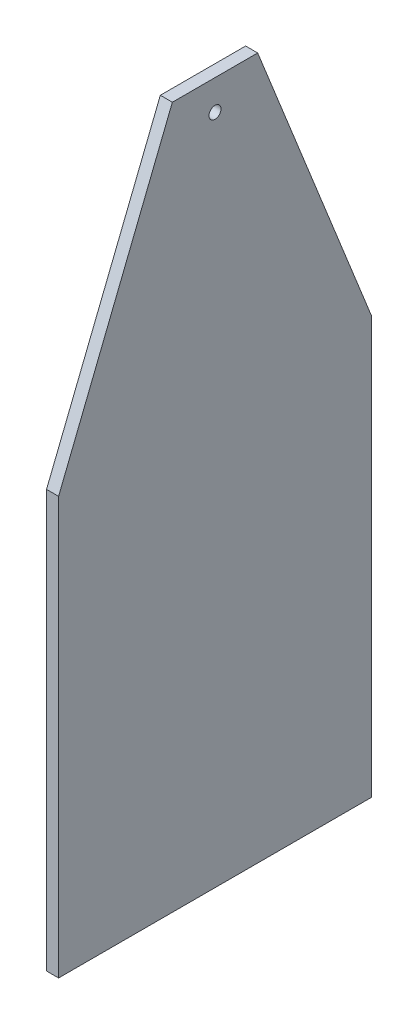
ISO-10303-21;
HEADER;
FILE_DESCRIPTION(('STEP AP214'),'2;1');
FILE_NAME('part.step','',(''),(''),'','','');
FILE_SCHEMA(('AUTOMOTIVE_DESIGN { 1 0 10303 214 1 1 1 1 }'));
ENDSEC;
DATA;
#1=APPLICATION_CONTEXT('core data for automotive mechanical design processes');
#2=APPLICATION_PROTOCOL_DEFINITION('international standard','automotive_design',2000,#1);
#3=PRODUCT_CONTEXT('',#1,'mechanical');
#4=PRODUCT('Part','Part','',(#3));
#5=PRODUCT_RELATED_PRODUCT_CATEGORY('part','',(#4));
#6=PRODUCT_DEFINITION_FORMATION('','',#4);
#7=PRODUCT_DEFINITION_CONTEXT('part definition',#1,'design');
#8=PRODUCT_DEFINITION('design','',#6,#7);
#9=PRODUCT_DEFINITION_SHAPE('','',#8);
#10=(LENGTH_UNIT() NAMED_UNIT(*) SI_UNIT(.MILLI.,.METRE.));
#11=(NAMED_UNIT(*) PLANE_ANGLE_UNIT() SI_UNIT($,.RADIAN.));
#12=(NAMED_UNIT(*) SI_UNIT($,.STERADIAN.) SOLID_ANGLE_UNIT());
#13=UNCERTAINTY_MEASURE_WITH_UNIT(LENGTH_MEASURE(1.E-05),#10,'distance_accuracy_value','');
#14=(GEOMETRIC_REPRESENTATION_CONTEXT(3) GLOBAL_UNCERTAINTY_ASSIGNED_CONTEXT((#13)) GLOBAL_UNIT_ASSIGNED_CONTEXT((#10,
#11,#12)) REPRESENTATION_CONTEXT('',''));
#15=CARTESIAN_POINT('',(0.,0.,0.));
#16=DIRECTION('',(0.,0.,1.));
#17=DIRECTION('',(1.,0.,0.));
#18=AXIS2_PLACEMENT_3D('',#15,#16,#17);
#19=CARTESIAN_POINT('',(0.,370.,-82.5));
#20=DIRECTION('',(1.,0.,0.));
#21=DIRECTION('',(0.,0.,-1.));
#22=AXIS2_PLACEMENT_3D('',#19,#20,#21);
#23=PLANE('',#22);
#24=CARTESIAN_POINT('',(0.,354.147260033209,0.));
#25=DIRECTION('',(1.,0.,0.));
#26=DIRECTION('',(0.,0.,-1.));
#27=AXIS2_PLACEMENT_3D('',#24,#25,#26);
#28=CIRCLE('',#27,3.17499999999998);
#29=CARTESIAN_POINT('',(0.,354.147260033209,-3.17499999999998));
#30=VERTEX_POINT('',#29);
#31=EDGE_CURVE('E131',#30,#30,#28,.T.);
#32=ORIENTED_EDGE('',*,*,#31,.T.);
#33=EDGE_LOOP('',(#32));
#34=FACE_BOUND('',#33,.T.);
#35=DIRECTION('',(0.,0.,1.));
#36=VECTOR('',#35,1.);
#37=CARTESIAN_POINT('',(0.,370.,-82.5));
#38=LINE('',#37,#36);
#39=CARTESIAN_POINT('',(0.,370.,-22.5));
#40=VERTEX_POINT('',#39);
#41=CARTESIAN_POINT('',(0.,370.,22.5));
#42=VERTEX_POINT('',#41);
#43=EDGE_CURVE('E98',#40,#42,#38,.T.);
#44=ORIENTED_EDGE('',*,*,#43,.F.);
#45=DIRECTION('',(0.,-0.928476690885259,-0.371390676354104));
#46=VECTOR('',#45,1.);
#47=CARTESIAN_POINT('',(0.,370.,-22.5));
#48=LINE('',#47,#46);
#49=CARTESIAN_POINT('',(0.,220.,-82.5));
#50=VERTEX_POINT('',#49);
#51=EDGE_CURVE('E47',#40,#50,#48,.T.);
#52=ORIENTED_EDGE('',*,*,#51,.T.);
#53=DIRECTION('',(0.,-1.,0.));
#54=VECTOR('',#53,1.);
#55=CARTESIAN_POINT('',(0.,370.,-82.5));
#56=LINE('',#55,#54);
#57=CARTESIAN_POINT('',(0.,0.,-82.5));
#58=VERTEX_POINT('',#57);
#59=EDGE_CURVE('E95',#50,#58,#56,.T.);
#60=ORIENTED_EDGE('',*,*,#59,.T.);
#61=DIRECTION('',(0.,0.,1.));
#62=VECTOR('',#61,1.);
#63=CARTESIAN_POINT('',(0.,0.,-82.5));
#64=LINE('',#63,#62);
#65=CARTESIAN_POINT('',(0.,0.,82.5));
#66=VERTEX_POINT('',#65);
#67=EDGE_CURVE('E127',#58,#66,#64,.T.);
#68=ORIENTED_EDGE('',*,*,#67,.T.);
#69=DIRECTION('',(0.,-1.,0.));
#70=VECTOR('',#69,1.);
#71=CARTESIAN_POINT('',(0.,370.,82.5));
#72=LINE('',#71,#70);
#73=CARTESIAN_POINT('',(0.,220.,82.5));
#74=VERTEX_POINT('',#73);
#75=EDGE_CURVE('E11',#74,#66,#72,.T.);
#76=ORIENTED_EDGE('',*,*,#75,.F.);
#77=DIRECTION('',(0.,0.928476690885259,-0.371390676354104));
#78=VECTOR('',#77,1.);
#79=CARTESIAN_POINT('',(0.,370.,22.5));
#80=LINE('',#79,#78);
#81=EDGE_CURVE('E142',#74,#42,#80,.T.);
#82=ORIENTED_EDGE('',*,*,#81,.T.);
#83=EDGE_LOOP('',(#44,#52,#60,#68,#76,#82));
#84=FACE_BOUND('',#83,.T.);
#85=ADVANCED_FACE('F33',(#34,#84),#23,.F.);
#86=CARTESIAN_POINT('',(0.,370.,82.5));
#87=DIRECTION('',(0.,0.,-1.));
#88=DIRECTION('',(-1.,0.,0.));
#89=AXIS2_PLACEMENT_3D('',#86,#87,#88);
#90=PLANE('',#89);
#91=DIRECTION('',(0.,-1.,0.));
#92=VECTOR('',#91,1.);
#93=CARTESIAN_POINT('',(6.35000000000001,370.,82.5));
#94=LINE('',#93,#92);
#95=CARTESIAN_POINT('',(6.35000000000001,220.,82.5));
#96=VERTEX_POINT('',#95);
#97=CARTESIAN_POINT('',(6.35000000000001,0.,82.5));
#98=VERTEX_POINT('',#97);
#99=EDGE_CURVE('E40',#96,#98,#94,.T.);
#100=ORIENTED_EDGE('',*,*,#99,.F.);
#101=DIRECTION('',(1.,0.,0.));
#102=VECTOR('',#101,1.);
#103=CARTESIAN_POINT('',(0.,220.,82.5));
#104=LINE('',#103,#102);
#105=EDGE_CURVE('E140',#74,#96,#104,.T.);
#106=ORIENTED_EDGE('',*,*,#105,.F.);
#107=ORIENTED_EDGE('',*,*,#75,.T.);
#108=DIRECTION('',(1.,0.,0.));
#109=VECTOR('',#108,1.);
#110=CARTESIAN_POINT('',(0.,0.,82.5));
#111=LINE('',#110,#109);
#112=EDGE_CURVE('E123',#66,#98,#111,.T.);
#113=ORIENTED_EDGE('',*,*,#112,.T.);
#114=EDGE_LOOP('',(#100,#106,#107,#113));
#115=FACE_BOUND('',#114,.T.);
#116=ADVANCED_FACE('F124',(#115),#90,.F.);
#117=CARTESIAN_POINT('',(6.35,370.,-82.5));
#118=DIRECTION('',(-1.,0.,0.));
#119=DIRECTION('',(0.,0.,1.));
#120=AXIS2_PLACEMENT_3D('',#117,#118,#119);
#121=PLANE('',#120);
#122=CARTESIAN_POINT('',(6.35000000000001,354.147260033209,0.));
#123=DIRECTION('',(1.,0.,0.));
#124=DIRECTION('',(0.,0.,-1.));
#125=AXIS2_PLACEMENT_3D('',#122,#123,#124);
#126=CIRCLE('',#125,3.17499999999998);
#127=CARTESIAN_POINT('',(6.35000000000001,354.147260033209,-3.17499999999998));
#128=VERTEX_POINT('',#127);
#129=EDGE_CURVE('E136',#128,#128,#126,.T.);
#130=ORIENTED_EDGE('',*,*,#129,.F.);
#131=EDGE_LOOP('',(#130));
#132=FACE_BOUND('',#131,.T.);
#133=DIRECTION('',(0.,-1.,0.));
#134=VECTOR('',#133,1.);
#135=CARTESIAN_POINT('',(6.35,370.,-82.5));
#136=LINE('',#135,#134);
#137=CARTESIAN_POINT('',(6.35,220.,-82.5));
#138=VERTEX_POINT('',#137);
#139=CARTESIAN_POINT('',(6.35,0.,-82.5));
#140=VERTEX_POINT('',#139);
#141=EDGE_CURVE('E104',#138,#140,#136,.T.);
#142=ORIENTED_EDGE('',*,*,#141,.F.);
#143=DIRECTION('',(0.,-0.928476690885259,-0.371390676354104));
#144=VECTOR('',#143,1.);
#145=CARTESIAN_POINT('',(6.35000000000001,370.,-22.5));
#146=LINE('',#145,#144);
#147=CARTESIAN_POINT('',(6.35000000000001,370.,-22.5));
#148=VERTEX_POINT('',#147);
#149=EDGE_CURVE('E86',#148,#138,#146,.T.);
#150=ORIENTED_EDGE('',*,*,#149,.F.);
#151=DIRECTION('',(0.,0.,-1.));
#152=VECTOR('',#151,1.);
#153=CARTESIAN_POINT('',(6.35,370.,-82.5));
#154=LINE('',#153,#152);
#155=CARTESIAN_POINT('',(6.35000000000001,370.,22.5));
#156=VERTEX_POINT('',#155);
#157=EDGE_CURVE('E105',#156,#148,#154,.T.);
#158=ORIENTED_EDGE('',*,*,#157,.F.);
#159=DIRECTION('',(0.,0.928476690885259,-0.371390676354104));
#160=VECTOR('',#159,1.);
#161=CARTESIAN_POINT('',(6.35000000000001,370.,22.5));
#162=LINE('',#161,#160);
#163=EDGE_CURVE('E55',#96,#156,#162,.T.);
#164=ORIENTED_EDGE('',*,*,#163,.F.);
#165=ORIENTED_EDGE('',*,*,#99,.T.);
#166=DIRECTION('',(0.,0.,-1.));
#167=VECTOR('',#166,1.);
#168=CARTESIAN_POINT('',(6.35,0.,-82.5));
#169=LINE('',#168,#167);
#170=EDGE_CURVE('E118',#98,#140,#169,.T.);
#171=ORIENTED_EDGE('',*,*,#170,.T.);
#172=EDGE_LOOP('',(#142,#150,#158,#164,#165,#171));
#173=FACE_BOUND('',#172,.T.);
#174=ADVANCED_FACE('F116',(#132,#173),#121,.F.);
#175=CARTESIAN_POINT('',(0.,370.,-82.5));
#176=DIRECTION('',(0.,0.,1.));
#177=DIRECTION('',(1.,0.,0.));
#178=AXIS2_PLACEMENT_3D('',#175,#176,#177);
#179=PLANE('',#178);
#180=ORIENTED_EDGE('',*,*,#59,.F.);
#181=DIRECTION('',(1.,0.,0.));
#182=VECTOR('',#181,1.);
#183=CARTESIAN_POINT('',(0.,220.,-82.5));
#184=LINE('',#183,#182);
#185=EDGE_CURVE('E83',#50,#138,#184,.T.);
#186=ORIENTED_EDGE('',*,*,#185,.T.);
#187=ORIENTED_EDGE('',*,*,#141,.T.);
#188=DIRECTION('',(-1.,0.,0.));
#189=VECTOR('',#188,1.);
#190=CARTESIAN_POINT('',(0.,0.,-82.5));
#191=LINE('',#190,#189);
#192=EDGE_CURVE('E102',#140,#58,#191,.T.);
#193=ORIENTED_EDGE('',*,*,#192,.T.);
#194=EDGE_LOOP('',(#180,#186,#187,#193));
#195=FACE_BOUND('',#194,.T.);
#196=ADVANCED_FACE('F100',(#195),#179,.F.);
#197=CARTESIAN_POINT('',(0.,370.,0.));
#198=DIRECTION('',(0.,1.,0.));
#199=DIRECTION('',(0.,0.,1.));
#200=AXIS2_PLACEMENT_3D('',#197,#198,#199);
#201=PLANE('',#200);
#202=DIRECTION('',(1.,0.,0.));
#203=VECTOR('',#202,1.);
#204=CARTESIAN_POINT('',(0.,370.,-22.5));
#205=LINE('',#204,#203);
#206=EDGE_CURVE('E90',#40,#148,#205,.T.);
#207=ORIENTED_EDGE('',*,*,#206,.F.);
#208=ORIENTED_EDGE('',*,*,#43,.T.);
#209=DIRECTION('',(1.,0.,0.));
#210=VECTOR('',#209,1.);
#211=CARTESIAN_POINT('',(0.,370.,22.5));
#212=LINE('',#211,#210);
#213=EDGE_CURVE('E139',#42,#156,#212,.T.);
#214=ORIENTED_EDGE('',*,*,#213,.T.);
#215=ORIENTED_EDGE('',*,*,#157,.T.);
#216=EDGE_LOOP('',(#207,#208,#214,#215));
#217=FACE_BOUND('',#216,.T.);
#218=ADVANCED_FACE('F148',(#217),#201,.T.);
#219=CARTESIAN_POINT('',(0.,0.,0.));
#220=DIRECTION('',(0.,1.,0.));
#221=DIRECTION('',(0.,0.,1.));
#222=AXIS2_PLACEMENT_3D('',#219,#220,#221);
#223=PLANE('',#222);
#224=ORIENTED_EDGE('',*,*,#67,.F.);
#225=ORIENTED_EDGE('',*,*,#192,.F.);
#226=ORIENTED_EDGE('',*,*,#170,.F.);
#227=ORIENTED_EDGE('',*,*,#112,.F.);
#228=EDGE_LOOP('',(#224,#225,#226,#227));
#229=FACE_BOUND('',#228,.T.);
#230=ADVANCED_FACE('F129',(#229),#223,.F.);
#231=CARTESIAN_POINT('',(6.35000000000001,354.147260033209,0.));
#232=DIRECTION('',(1.,0.,0.));
#233=DIRECTION('',(0.,0.,-1.));
#234=AXIS2_PLACEMENT_3D('',#231,#232,#233);
#235=CYLINDRICAL_SURFACE('',#234,3.17499999999998);
#236=ORIENTED_EDGE('',*,*,#31,.F.);
#237=EDGE_LOOP('',(#236));
#238=FACE_BOUND('',#237,.T.);
#239=ORIENTED_EDGE('',*,*,#129,.T.);
#240=EDGE_LOOP('',(#239));
#241=FACE_BOUND('',#240,.T.);
#242=ADVANCED_FACE('F151',(#238,#241),#235,.F.);
#243=CARTESIAN_POINT('',(0.,370.,22.5));
#244=DIRECTION('',(0.,-0.371390676354104,-0.928476690885259));
#245=DIRECTION('',(0.,0.92847669088526,-0.371390676354104));
#246=AXIS2_PLACEMENT_3D('',#243,#244,#245);
#247=PLANE('',#246);
#248=ORIENTED_EDGE('',*,*,#163,.T.);
#249=ORIENTED_EDGE('',*,*,#213,.F.);
#250=ORIENTED_EDGE('',*,*,#81,.F.);
#251=ORIENTED_EDGE('',*,*,#105,.T.);
#252=EDGE_LOOP('',(#248,#249,#250,#251));
#253=FACE_BOUND('',#252,.T.);
#254=ADVANCED_FACE('F149',(#253),#247,.F.);
#255=CARTESIAN_POINT('',(0.,370.,-22.5));
#256=DIRECTION('',(0.,-0.371390676354104,0.928476690885259));
#257=DIRECTION('',(0.,-0.928476690885259,-0.371390676354104));
#258=AXIS2_PLACEMENT_3D('',#255,#256,#257);
#259=PLANE('',#258);
#260=ORIENTED_EDGE('',*,*,#149,.T.);
#261=ORIENTED_EDGE('',*,*,#185,.F.);
#262=ORIENTED_EDGE('',*,*,#51,.F.);
#263=ORIENTED_EDGE('',*,*,#206,.T.);
#264=EDGE_LOOP('',(#260,#261,#262,#263));
#265=FACE_BOUND('',#264,.T.);
#266=ADVANCED_FACE('F84',(#265),#259,.F.);
#267=CLOSED_SHELL('',(#85,#116,#174,#196,#218,#230,#242,#254,#266));
#268=MANIFOLD_SOLID_BREP('B2',#267);
#269=ADVANCED_BREP_SHAPE_REPRESENTATION('',(#18,#268),#14);
#270=SHAPE_DEFINITION_REPRESENTATION(#9,#269);
ENDSEC;
END-ISO-10303-21;
